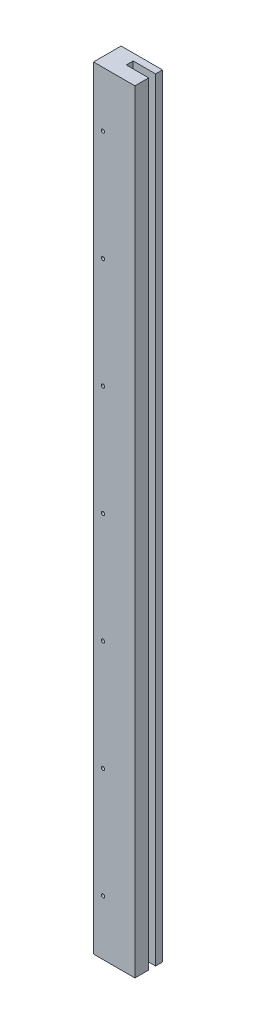
ISO-10303-21;
HEADER;
FILE_DESCRIPTION(('STEP AP214'),'2;1');
FILE_NAME('part.step','',(''),(''),'','','');
FILE_SCHEMA(('AUTOMOTIVE_DESIGN { 1 0 10303 214 1 1 1 1 }'));
ENDSEC;
DATA;
#1=APPLICATION_CONTEXT('core data for automotive mechanical design processes');
#2=APPLICATION_PROTOCOL_DEFINITION('international standard','automotive_design',2000,#1);
#3=PRODUCT_CONTEXT('',#1,'mechanical');
#4=PRODUCT('Part','Part','',(#3));
#5=PRODUCT_RELATED_PRODUCT_CATEGORY('part','',(#4));
#6=PRODUCT_DEFINITION_FORMATION('','',#4);
#7=PRODUCT_DEFINITION_CONTEXT('part definition',#1,'design');
#8=PRODUCT_DEFINITION('design','',#6,#7);
#9=PRODUCT_DEFINITION_SHAPE('','',#8);
#10=(LENGTH_UNIT() NAMED_UNIT(*) SI_UNIT(.MILLI.,.METRE.));
#11=(NAMED_UNIT(*) PLANE_ANGLE_UNIT() SI_UNIT($,.RADIAN.));
#12=(NAMED_UNIT(*) SI_UNIT($,.STERADIAN.) SOLID_ANGLE_UNIT());
#13=UNCERTAINTY_MEASURE_WITH_UNIT(LENGTH_MEASURE(1.E-05),#10,'distance_accuracy_value','');
#14=(GEOMETRIC_REPRESENTATION_CONTEXT(3) GLOBAL_UNCERTAINTY_ASSIGNED_CONTEXT((#13)) GLOBAL_UNIT_ASSIGNED_CONTEXT((#10,
#11,#12)) REPRESENTATION_CONTEXT('',''));
#15=CARTESIAN_POINT('',(0.,0.,0.));
#16=DIRECTION('',(0.,0.,1.));
#17=DIRECTION('',(1.,0.,0.));
#18=AXIS2_PLACEMENT_3D('',#15,#16,#17);
#19=CARTESIAN_POINT('',(-458.7875,756.990501198393,292.1));
#20=DIRECTION('',(-1.,0.,0.));
#21=DIRECTION('',(0.,0.,1.));
#22=AXIS2_PLACEMENT_3D('',#19,#20,#21);
#23=PLANE('',#22);
#24=DIRECTION('',(0.,-1.,0.));
#25=VECTOR('',#24,1.);
#26=CARTESIAN_POINT('',(-458.7875,756.990501198393,292.1));
#27=LINE('',#26,#25);
#28=CARTESIAN_POINT('',(-458.7875,609.6,292.1));
#29=VERTEX_POINT('',#28);
#30=CARTESIAN_POINT('',(-458.7875,508.,292.1));
#31=VERTEX_POINT('',#30);
#32=EDGE_CURVE('E254',#29,#31,#27,.T.);
#33=ORIENTED_EDGE('',*,*,#32,.T.);
#34=CARTESIAN_POINT('',(-458.7875,508.,288.925));
#35=DIRECTION('',(1.,0.,0.));
#36=DIRECTION('',(0.,0.,-1.));
#37=AXIS2_PLACEMENT_3D('',#34,#35,#36);
#38=CIRCLE('',#37,3.17499999999997);
#39=CARTESIAN_POINT('',(-458.7875,508.,285.75));
#40=VERTEX_POINT('',#39);
#41=EDGE_CURVE('E280',#40,#31,#38,.T.);
#42=ORIENTED_EDGE('',*,*,#41,.F.);
#43=DIRECTION('',(0.,-1.,0.));
#44=VECTOR('',#43,1.);
#45=CARTESIAN_POINT('',(-458.7875,756.990501198393,285.75));
#46=LINE('',#45,#44);
#47=CARTESIAN_POINT('',(-458.7875,609.6,285.75));
#48=VERTEX_POINT('',#47);
#49=EDGE_CURVE('E173',#48,#40,#46,.T.);
#50=ORIENTED_EDGE('',*,*,#49,.F.);
#51=CARTESIAN_POINT('',(-458.7875,609.6,288.925));
#52=DIRECTION('',(1.,0.,0.));
#53=DIRECTION('',(0.,0.,-1.));
#54=AXIS2_PLACEMENT_3D('',#51,#52,#53);
#55=CIRCLE('',#54,3.17499999999997);
#56=EDGE_CURVE('E281',#29,#48,#55,.T.);
#57=ORIENTED_EDGE('',*,*,#56,.F.);
#58=EDGE_LOOP('',(#33,#42,#50,#57));
#59=FACE_BOUND('',#58,.T.);
#60=ADVANCED_FACE('F37',(#59),#23,.F.);
#61=CARTESIAN_POINT('',(-458.7875,406.4,285.75));
#62=VERTEX_POINT('',#61);
#63=EDGE_CURVE('E416',#40,#62,#46,.T.);
#64=ORIENTED_EDGE('',*,*,#63,.F.);
#65=EDGE_CURVE('E275',#31,#40,#38,.T.);
#66=ORIENTED_EDGE('',*,*,#65,.F.);
#67=CARTESIAN_POINT('',(-458.7875,406.4,292.1));
#68=VERTEX_POINT('',#67);
#69=EDGE_CURVE('E255',#31,#68,#27,.T.);
#70=ORIENTED_EDGE('',*,*,#69,.T.);
#71=CARTESIAN_POINT('',(-458.7875,406.4,288.925));
#72=DIRECTION('',(1.,0.,0.));
#73=DIRECTION('',(0.,0.,-1.));
#74=AXIS2_PLACEMENT_3D('',#71,#72,#73);
#75=CIRCLE('',#74,3.17499999999997);
#76=EDGE_CURVE('E273',#62,#68,#75,.T.);
#77=ORIENTED_EDGE('',*,*,#76,.F.);
#78=EDGE_LOOP('',(#64,#66,#70,#77));
#79=FACE_BOUND('',#78,.T.);
#80=ADVANCED_FACE('F272',(#79),#23,.F.);
#81=CARTESIAN_POINT('',(-458.7875,304.8,285.75));
#82=VERTEX_POINT('',#81);
#83=EDGE_CURVE('E168',#62,#82,#46,.T.);
#84=ORIENTED_EDGE('',*,*,#83,.F.);
#85=EDGE_CURVE('E305',#68,#62,#75,.T.);
#86=ORIENTED_EDGE('',*,*,#85,.F.);
#87=CARTESIAN_POINT('',(-458.7875,304.8,292.1));
#88=VERTEX_POINT('',#87);
#89=EDGE_CURVE('E258',#68,#88,#27,.T.);
#90=ORIENTED_EDGE('',*,*,#89,.T.);
#91=CARTESIAN_POINT('',(-458.7875,304.8,288.925));
#92=DIRECTION('',(1.,0.,0.));
#93=DIRECTION('',(0.,0.,-1.));
#94=AXIS2_PLACEMENT_3D('',#91,#92,#93);
#95=CIRCLE('',#94,3.17499999999997);
#96=EDGE_CURVE('E300',#82,#88,#95,.T.);
#97=ORIENTED_EDGE('',*,*,#96,.F.);
#98=EDGE_LOOP('',(#84,#86,#90,#97));
#99=FACE_BOUND('',#98,.T.);
#100=ADVANCED_FACE('F396',(#99),#23,.F.);
#101=CARTESIAN_POINT('',(-458.7875,203.2,285.75));
#102=VERTEX_POINT('',#101);
#103=EDGE_CURVE('E167',#82,#102,#46,.T.);
#104=ORIENTED_EDGE('',*,*,#103,.F.);
#105=EDGE_CURVE('E299',#88,#82,#95,.T.);
#106=ORIENTED_EDGE('',*,*,#105,.F.);
#107=CARTESIAN_POINT('',(-458.7875,203.2,292.1));
#108=VERTEX_POINT('',#107);
#109=EDGE_CURVE('E256',#88,#108,#27,.T.);
#110=ORIENTED_EDGE('',*,*,#109,.T.);
#111=CARTESIAN_POINT('',(-458.7875,203.2,288.925));
#112=DIRECTION('',(1.,0.,0.));
#113=DIRECTION('',(0.,0.,-1.));
#114=AXIS2_PLACEMENT_3D('',#111,#112,#113);
#115=CIRCLE('',#114,3.17499999999997);
#116=EDGE_CURVE('E60',#102,#108,#115,.T.);
#117=ORIENTED_EDGE('',*,*,#116,.F.);
#118=EDGE_LOOP('',(#104,#106,#110,#117));
#119=FACE_BOUND('',#118,.T.);
#120=ADVANCED_FACE('F408',(#119),#23,.F.);
#121=CARTESIAN_POINT('',(-458.7875,101.6,285.75));
#122=VERTEX_POINT('',#121);
#123=EDGE_CURVE('E149',#102,#122,#46,.T.);
#124=ORIENTED_EDGE('',*,*,#123,.F.);
#125=EDGE_CURVE('E294',#108,#102,#115,.T.);
#126=ORIENTED_EDGE('',*,*,#125,.F.);
#127=CARTESIAN_POINT('',(-458.7875,101.6,292.1));
#128=VERTEX_POINT('',#127);
#129=EDGE_CURVE('E152',#108,#128,#27,.T.);
#130=ORIENTED_EDGE('',*,*,#129,.T.);
#131=CARTESIAN_POINT('',(-458.7875,101.6,288.925));
#132=DIRECTION('',(1.,0.,0.));
#133=DIRECTION('',(0.,0.,-1.));
#134=AXIS2_PLACEMENT_3D('',#131,#132,#133);
#135=CIRCLE('',#134,3.17499999999997);
#136=EDGE_CURVE('E53',#122,#128,#135,.T.);
#137=ORIENTED_EDGE('',*,*,#136,.F.);
#138=EDGE_LOOP('',(#124,#126,#130,#137));
#139=FACE_BOUND('',#138,.T.);
#140=ADVANCED_FACE('F147',(#139),#23,.F.);
#141=CARTESIAN_POINT('',(-458.7875,711.2,292.1));
#142=VERTEX_POINT('',#141);
#143=EDGE_CURVE('E174',#142,#29,#27,.T.);
#144=ORIENTED_EDGE('',*,*,#143,.T.);
#145=EDGE_CURVE('E284',#48,#29,#55,.T.);
#146=ORIENTED_EDGE('',*,*,#145,.F.);
#147=CARTESIAN_POINT('',(-458.7875,711.2,285.75));
#148=VERTEX_POINT('',#147);
#149=EDGE_CURVE('E163',#148,#48,#46,.T.);
#150=ORIENTED_EDGE('',*,*,#149,.F.);
#151=DIRECTION('',(0.,0.,-1.));
#152=VECTOR('',#151,1.);
#153=CARTESIAN_POINT('',(-458.7875,711.2,292.1));
#154=LINE('',#153,#152);
#155=EDGE_CURVE('E216',#142,#148,#154,.T.);
#156=ORIENTED_EDGE('',*,*,#155,.F.);
#157=EDGE_LOOP('',(#144,#146,#150,#156));
#158=FACE_BOUND('',#157,.T.);
#159=ADVANCED_FACE('F249',(#158),#23,.F.);
#160=CARTESIAN_POINT('',(-476.25,756.990501198393,304.8));
#161=DIRECTION('',(0.,0.,-1.));
#162=DIRECTION('',(-1.,0.,0.));
#163=AXIS2_PLACEMENT_3D('',#160,#161,#162);
#164=PLANE('',#163);
#165=CARTESIAN_POINT('',(-467.51875,660.4,304.8));
#166=DIRECTION('',(0.,0.,1.));
#167=DIRECTION('',(1.,0.,0.));
#168=AXIS2_PLACEMENT_3D('',#165,#166,#167);
#169=CIRCLE('',#168,1.58750000000004);
#170=CARTESIAN_POINT('',(-465.93125,660.4,304.8));
#171=VERTEX_POINT('',#170);
#172=EDGE_CURVE('E346',#171,#171,#169,.T.);
#173=ORIENTED_EDGE('',*,*,#172,.F.);
#174=EDGE_LOOP('',(#173));
#175=FACE_BOUND('',#174,.T.);
#176=CARTESIAN_POINT('',(-467.51875,558.8,304.8));
#177=DIRECTION('',(0.,0.,1.));
#178=DIRECTION('',(1.,0.,0.));
#179=AXIS2_PLACEMENT_3D('',#176,#177,#178);
#180=CIRCLE('',#179,1.58750000000004);
#181=CARTESIAN_POINT('',(-465.93125,558.8,304.8));
#182=VERTEX_POINT('',#181);
#183=EDGE_CURVE('E340',#182,#182,#180,.T.);
#184=ORIENTED_EDGE('',*,*,#183,.F.);
#185=EDGE_LOOP('',(#184));
#186=FACE_BOUND('',#185,.T.);
#187=CARTESIAN_POINT('',(-467.51875,457.2,304.8));
#188=DIRECTION('',(0.,0.,1.));
#189=DIRECTION('',(1.,0.,0.));
#190=AXIS2_PLACEMENT_3D('',#187,#188,#189);
#191=CIRCLE('',#190,1.58750000000004);
#192=CARTESIAN_POINT('',(-465.93125,457.2,304.8));
#193=VERTEX_POINT('',#192);
#194=EDGE_CURVE('E334',#193,#193,#191,.T.);
#195=ORIENTED_EDGE('',*,*,#194,.F.);
#196=EDGE_LOOP('',(#195));
#197=FACE_BOUND('',#196,.T.);
#198=CARTESIAN_POINT('',(-467.51875,355.6,304.8));
#199=DIRECTION('',(0.,0.,1.));
#200=DIRECTION('',(1.,0.,0.));
#201=AXIS2_PLACEMENT_3D('',#198,#199,#200);
#202=CIRCLE('',#201,1.58750000000004);
#203=CARTESIAN_POINT('',(-465.93125,355.6,304.8));
#204=VERTEX_POINT('',#203);
#205=EDGE_CURVE('E328',#204,#204,#202,.T.);
#206=ORIENTED_EDGE('',*,*,#205,.F.);
#207=EDGE_LOOP('',(#206));
#208=FACE_BOUND('',#207,.T.);
#209=CARTESIAN_POINT('',(-467.51875,254.,304.8));
#210=DIRECTION('',(0.,0.,1.));
#211=DIRECTION('',(1.,0.,0.));
#212=AXIS2_PLACEMENT_3D('',#209,#210,#211);
#213=CIRCLE('',#212,1.58750000000004);
#214=CARTESIAN_POINT('',(-465.93125,254.,304.8));
#215=VERTEX_POINT('',#214);
#216=EDGE_CURVE('E322',#215,#215,#213,.T.);
#217=ORIENTED_EDGE('',*,*,#216,.F.);
#218=EDGE_LOOP('',(#217));
#219=FACE_BOUND('',#218,.T.);
#220=CARTESIAN_POINT('',(-467.51875,152.4,304.8));
#221=DIRECTION('',(0.,0.,1.));
#222=DIRECTION('',(1.,0.,0.));
#223=AXIS2_PLACEMENT_3D('',#220,#221,#222);
#224=CIRCLE('',#223,1.58750000000004);
#225=CARTESIAN_POINT('',(-465.93125,152.4,304.8));
#226=VERTEX_POINT('',#225);
#227=EDGE_CURVE('E314',#226,#226,#224,.T.);
#228=ORIENTED_EDGE('',*,*,#227,.F.);
#229=EDGE_LOOP('',(#228));
#230=FACE_BOUND('',#229,.T.);
#231=CARTESIAN_POINT('',(-467.51875,50.8,304.8));
#232=DIRECTION('',(0.,0.,1.));
#233=DIRECTION('',(1.,0.,0.));
#234=AXIS2_PLACEMENT_3D('',#231,#232,#233);
#235=CIRCLE('',#234,1.58750000000004);
#236=CARTESIAN_POINT('',(-465.93125,50.8,304.8));
#237=VERTEX_POINT('',#236);
#238=EDGE_CURVE('E311',#237,#237,#235,.T.);
#239=ORIENTED_EDGE('',*,*,#238,.F.);
#240=EDGE_LOOP('',(#239));
#241=FACE_BOUND('',#240,.T.);
#242=DIRECTION('',(1.,0.,0.));
#243=VECTOR('',#242,1.);
#244=CARTESIAN_POINT('',(-476.25,711.2,304.8));
#245=LINE('',#244,#243);
#246=CARTESIAN_POINT('',(-476.25,711.2,304.8));
#247=VERTEX_POINT('',#246);
#248=CARTESIAN_POINT('',(-438.15,711.2,304.8));
#249=VERTEX_POINT('',#248);
#250=EDGE_CURVE('E225',#247,#249,#245,.T.);
#251=ORIENTED_EDGE('',*,*,#250,.F.);
#252=DIRECTION('',(0.,-1.,0.));
#253=VECTOR('',#252,1.);
#254=CARTESIAN_POINT('',(-476.25,756.990501198393,304.8));
#255=LINE('',#254,#253);
#256=CARTESIAN_POINT('',(-476.25,0.,304.8));
#257=VERTEX_POINT('',#256);
#258=EDGE_CURVE('E41',#247,#257,#255,.T.);
#259=ORIENTED_EDGE('',*,*,#258,.T.);
#260=DIRECTION('',(1.,0.,0.));
#261=VECTOR('',#260,1.);
#262=CARTESIAN_POINT('',(-476.25,0.,304.8));
#263=LINE('',#262,#261);
#264=CARTESIAN_POINT('',(-438.15,0.,304.8));
#265=VERTEX_POINT('',#264);
#266=EDGE_CURVE('E208',#257,#265,#263,.T.);
#267=ORIENTED_EDGE('',*,*,#266,.T.);
#268=DIRECTION('',(0.,-1.,0.));
#269=VECTOR('',#268,1.);
#270=CARTESIAN_POINT('',(-438.15,756.990501198393,304.8));
#271=LINE('',#270,#269);
#272=EDGE_CURVE('E207',#249,#265,#271,.T.);
#273=ORIENTED_EDGE('',*,*,#272,.F.);
#274=EDGE_LOOP('',(#251,#259,#267,#273));
#275=FACE_BOUND('',#274,.T.);
#276=ADVANCED_FACE('F363',(#175,#186,#197,#208,#219,#230,#241,#275),#164,.F.);
#277=CARTESIAN_POINT('',(-438.15,756.990501198393,304.8));
#278=DIRECTION('',(-1.,0.,0.));
#279=DIRECTION('',(0.,0.,1.));
#280=AXIS2_PLACEMENT_3D('',#277,#278,#279);
#281=PLANE('',#280);
#282=DIRECTION('',(0.,0.,-1.));
#283=VECTOR('',#282,1.);
#284=CARTESIAN_POINT('',(-438.15,711.2,304.8));
#285=LINE('',#284,#283);
#286=CARTESIAN_POINT('',(-438.15,711.2,292.1));
#287=VERTEX_POINT('',#286);
#288=EDGE_CURVE('E222',#249,#287,#285,.T.);
#289=ORIENTED_EDGE('',*,*,#288,.F.);
#290=ORIENTED_EDGE('',*,*,#272,.T.);
#291=DIRECTION('',(0.,0.,-1.));
#292=VECTOR('',#291,1.);
#293=CARTESIAN_POINT('',(-438.15,0.,304.8));
#294=LINE('',#293,#292);
#295=CARTESIAN_POINT('',(-438.15,0.,292.1));
#296=VERTEX_POINT('',#295);
#297=EDGE_CURVE('E204',#265,#296,#294,.T.);
#298=ORIENTED_EDGE('',*,*,#297,.T.);
#299=DIRECTION('',(0.,-1.,0.));
#300=VECTOR('',#299,1.);
#301=CARTESIAN_POINT('',(-438.15,756.990501198393,292.1));
#302=LINE('',#301,#300);
#303=EDGE_CURVE('E203',#287,#296,#302,.T.);
#304=ORIENTED_EDGE('',*,*,#303,.F.);
#305=EDGE_LOOP('',(#289,#290,#298,#304));
#306=FACE_BOUND('',#305,.T.);
#307=ADVANCED_FACE('F237',(#306),#281,.F.);
#308=CARTESIAN_POINT('',(-438.15,756.990501198393,292.1));
#309=DIRECTION('',(0.,0.,1.));
#310=DIRECTION('',(1.,0.,0.));
#311=AXIS2_PLACEMENT_3D('',#308,#309,#310);
#312=PLANE('',#311);
#313=DIRECTION('',(-1.,0.,0.));
#314=VECTOR('',#313,1.);
#315=CARTESIAN_POINT('',(-438.15,711.2,292.1));
#316=LINE('',#315,#314);
#317=EDGE_CURVE('E219',#287,#142,#316,.T.);
#318=ORIENTED_EDGE('',*,*,#317,.F.);
#319=ORIENTED_EDGE('',*,*,#303,.T.);
#320=DIRECTION('',(-1.,0.,0.));
#321=VECTOR('',#320,1.);
#322=CARTESIAN_POINT('',(-438.15,0.,292.1));
#323=LINE('',#322,#321);
#324=CARTESIAN_POINT('',(-458.7875,0.,292.1));
#325=VERTEX_POINT('',#324);
#326=EDGE_CURVE('E199',#296,#325,#323,.T.);
#327=ORIENTED_EDGE('',*,*,#326,.T.);
#328=EDGE_CURVE('E202',#128,#325,#27,.T.);
#329=ORIENTED_EDGE('',*,*,#328,.F.);
#330=ORIENTED_EDGE('',*,*,#129,.F.);
#331=ORIENTED_EDGE('',*,*,#109,.F.);
#332=ORIENTED_EDGE('',*,*,#89,.F.);
#333=ORIENTED_EDGE('',*,*,#69,.F.);
#334=ORIENTED_EDGE('',*,*,#32,.F.);
#335=ORIENTED_EDGE('',*,*,#143,.F.);
#336=EDGE_LOOP('',(#318,#319,#327,#329,#330,#331,#332,#333,#334,#335));
#337=FACE_BOUND('',#336,.T.);
#338=ADVANCED_FACE('F232',(#337),#312,.F.);
#339=CARTESIAN_POINT('',(-458.7875,0.,285.75));
#340=VERTEX_POINT('',#339);
#341=EDGE_CURVE('E155',#122,#340,#46,.T.);
#342=ORIENTED_EDGE('',*,*,#341,.F.);
#343=EDGE_CURVE('E137',#128,#122,#135,.T.);
#344=ORIENTED_EDGE('',*,*,#343,.F.);
#345=ORIENTED_EDGE('',*,*,#328,.T.);
#346=DIRECTION('',(0.,0.,-1.));
#347=VECTOR('',#346,1.);
#348=CARTESIAN_POINT('',(-458.7875,0.,292.1));
#349=LINE('',#348,#347);
#350=EDGE_CURVE('E158',#325,#340,#349,.T.);
#351=ORIENTED_EDGE('',*,*,#350,.T.);
#352=EDGE_LOOP('',(#342,#344,#345,#351));
#353=FACE_BOUND('',#352,.T.);
#354=ADVANCED_FACE('F156',(#353),#23,.F.);
#355=CARTESIAN_POINT('',(-458.7875,756.990501198393,285.75));
#356=DIRECTION('',(0.,0.,-1.));
#357=DIRECTION('',(-1.,0.,0.));
#358=AXIS2_PLACEMENT_3D('',#355,#356,#357);
#359=PLANE('',#358);
#360=DIRECTION('',(1.,0.,0.));
#361=VECTOR('',#360,1.);
#362=CARTESIAN_POINT('',(-458.7875,711.2,285.75));
#363=LINE('',#362,#361);
#364=CARTESIAN_POINT('',(-438.15,711.2,285.75));
#365=VERTEX_POINT('',#364);
#366=EDGE_CURVE('E213',#148,#365,#363,.T.);
#367=ORIENTED_EDGE('',*,*,#366,.F.);
#368=ORIENTED_EDGE('',*,*,#149,.T.);
#369=ORIENTED_EDGE('',*,*,#49,.T.);
#370=ORIENTED_EDGE('',*,*,#63,.T.);
#371=ORIENTED_EDGE('',*,*,#83,.T.);
#372=ORIENTED_EDGE('',*,*,#103,.T.);
#373=ORIENTED_EDGE('',*,*,#123,.T.);
#374=ORIENTED_EDGE('',*,*,#341,.T.);
#375=DIRECTION('',(1.,0.,0.));
#376=VECTOR('',#375,1.);
#377=CARTESIAN_POINT('',(-458.7875,0.,285.75));
#378=LINE('',#377,#376);
#379=CARTESIAN_POINT('',(-438.15,0.,285.75));
#380=VERTEX_POINT('',#379);
#381=EDGE_CURVE('E172',#340,#380,#378,.T.);
#382=ORIENTED_EDGE('',*,*,#381,.T.);
#383=DIRECTION('',(0.,-1.,0.));
#384=VECTOR('',#383,1.);
#385=CARTESIAN_POINT('',(-438.15,756.990501198393,285.75));
#386=LINE('',#385,#384);
#387=EDGE_CURVE('E176',#365,#380,#386,.T.);
#388=ORIENTED_EDGE('',*,*,#387,.F.);
#389=EDGE_LOOP('',(#367,#368,#369,#370,#371,#372,#373,#374,#382,#388));
#390=FACE_BOUND('',#389,.T.);
#391=ADVANCED_FACE('F164',(#390),#359,.F.);
#392=CARTESIAN_POINT('',(-438.15,756.990501198393,285.75));
#393=DIRECTION('',(-1.,0.,0.));
#394=DIRECTION('',(0.,0.,1.));
#395=AXIS2_PLACEMENT_3D('',#392,#393,#394);
#396=PLANE('',#395);
#397=DIRECTION('',(0.,0.,-1.));
#398=VECTOR('',#397,1.);
#399=CARTESIAN_POINT('',(-438.15,711.2,285.75));
#400=LINE('',#399,#398);
#401=CARTESIAN_POINT('',(-438.15,711.2,279.4));
#402=VERTEX_POINT('',#401);
#403=EDGE_CURVE('E46',#365,#402,#400,.T.);
#404=ORIENTED_EDGE('',*,*,#403,.F.);
#405=ORIENTED_EDGE('',*,*,#387,.T.);
#406=DIRECTION('',(0.,0.,-1.));
#407=VECTOR('',#406,1.);
#408=CARTESIAN_POINT('',(-438.15,0.,285.75));
#409=LINE('',#408,#407);
#410=CARTESIAN_POINT('',(-438.15,0.,279.4));
#411=VERTEX_POINT('',#410);
#412=EDGE_CURVE('E178',#380,#411,#409,.T.);
#413=ORIENTED_EDGE('',*,*,#412,.T.);
#414=DIRECTION('',(0.,-1.,0.));
#415=VECTOR('',#414,1.);
#416=CARTESIAN_POINT('',(-438.15,756.990501198393,279.4));
#417=LINE('',#416,#415);
#418=EDGE_CURVE('E179',#402,#411,#417,.T.);
#419=ORIENTED_EDGE('',*,*,#418,.F.);
#420=EDGE_LOOP('',(#404,#405,#413,#419));
#421=FACE_BOUND('',#420,.T.);
#422=ADVANCED_FACE('F388',(#421),#396,.F.);
#423=CARTESIAN_POINT('',(-438.15,756.990501198393,279.4));
#424=DIRECTION('',(0.,0.,1.));
#425=DIRECTION('',(1.,0.,0.));
#426=AXIS2_PLACEMENT_3D('',#423,#424,#425);
#427=PLANE('',#426);
#428=CARTESIAN_POINT('',(-467.51875,660.4,279.4));
#429=DIRECTION('',(0.,0.,1.));
#430=DIRECTION('',(1.,0.,0.));
#431=AXIS2_PLACEMENT_3D('',#428,#429,#430);
#432=CIRCLE('',#431,1.58750000000004);
#433=CARTESIAN_POINT('',(-465.93125,660.4,279.4));
#434=VERTEX_POINT('',#433);
#435=EDGE_CURVE('E349',#434,#434,#432,.T.);
#436=ORIENTED_EDGE('',*,*,#435,.T.);
#437=EDGE_LOOP('',(#436));
#438=FACE_BOUND('',#437,.T.);
#439=CARTESIAN_POINT('',(-467.51875,558.8,279.4));
#440=DIRECTION('',(0.,0.,1.));
#441=DIRECTION('',(1.,0.,0.));
#442=AXIS2_PLACEMENT_3D('',#439,#440,#441);
#443=CIRCLE('',#442,1.58750000000004);
#444=CARTESIAN_POINT('',(-465.93125,558.8,279.4));
#445=VERTEX_POINT('',#444);
#446=EDGE_CURVE('E343',#445,#445,#443,.T.);
#447=ORIENTED_EDGE('',*,*,#446,.T.);
#448=EDGE_LOOP('',(#447));
#449=FACE_BOUND('',#448,.T.);
#450=CARTESIAN_POINT('',(-467.51875,457.2,279.4));
#451=DIRECTION('',(0.,0.,1.));
#452=DIRECTION('',(1.,0.,0.));
#453=AXIS2_PLACEMENT_3D('',#450,#451,#452);
#454=CIRCLE('',#453,1.58750000000004);
#455=CARTESIAN_POINT('',(-465.93125,457.2,279.4));
#456=VERTEX_POINT('',#455);
#457=EDGE_CURVE('E337',#456,#456,#454,.T.);
#458=ORIENTED_EDGE('',*,*,#457,.T.);
#459=EDGE_LOOP('',(#458));
#460=FACE_BOUND('',#459,.T.);
#461=CARTESIAN_POINT('',(-467.51875,355.6,279.4));
#462=DIRECTION('',(0.,0.,1.));
#463=DIRECTION('',(1.,0.,0.));
#464=AXIS2_PLACEMENT_3D('',#461,#462,#463);
#465=CIRCLE('',#464,1.58750000000004);
#466=CARTESIAN_POINT('',(-465.93125,355.6,279.4));
#467=VERTEX_POINT('',#466);
#468=EDGE_CURVE('E331',#467,#467,#465,.T.);
#469=ORIENTED_EDGE('',*,*,#468,.T.);
#470=EDGE_LOOP('',(#469));
#471=FACE_BOUND('',#470,.T.);
#472=CARTESIAN_POINT('',(-467.51875,254.,279.4));
#473=DIRECTION('',(0.,0.,1.));
#474=DIRECTION('',(1.,0.,0.));
#475=AXIS2_PLACEMENT_3D('',#472,#473,#474);
#476=CIRCLE('',#475,1.58750000000004);
#477=CARTESIAN_POINT('',(-465.93125,254.,279.4));
#478=VERTEX_POINT('',#477);
#479=EDGE_CURVE('E325',#478,#478,#476,.T.);
#480=ORIENTED_EDGE('',*,*,#479,.T.);
#481=EDGE_LOOP('',(#480));
#482=FACE_BOUND('',#481,.T.);
#483=CARTESIAN_POINT('',(-467.51875,152.4,279.4));
#484=DIRECTION('',(0.,0.,1.));
#485=DIRECTION('',(1.,0.,0.));
#486=AXIS2_PLACEMENT_3D('',#483,#484,#485);
#487=CIRCLE('',#486,1.58750000000004);
#488=CARTESIAN_POINT('',(-465.93125,152.4,279.4));
#489=VERTEX_POINT('',#488);
#490=EDGE_CURVE('E319',#489,#489,#487,.T.);
#491=ORIENTED_EDGE('',*,*,#490,.T.);
#492=EDGE_LOOP('',(#491));
#493=FACE_BOUND('',#492,.T.);
#494=CARTESIAN_POINT('',(-467.51875,50.8,279.4));
#495=DIRECTION('',(0.,0.,1.));
#496=DIRECTION('',(1.,0.,0.));
#497=AXIS2_PLACEMENT_3D('',#494,#495,#496);
#498=CIRCLE('',#497,1.58750000000004);
#499=CARTESIAN_POINT('',(-465.93125,50.8,279.4));
#500=VERTEX_POINT('',#499);
#501=EDGE_CURVE('E142',#500,#500,#498,.T.);
#502=ORIENTED_EDGE('',*,*,#501,.T.);
#503=EDGE_LOOP('',(#502));
#504=FACE_BOUND('',#503,.T.);
#505=DIRECTION('',(-1.,0.,0.));
#506=VECTOR('',#505,1.);
#507=CARTESIAN_POINT('',(-438.15,711.2,279.4));
#508=LINE('',#507,#506);
#509=CARTESIAN_POINT('',(-476.25,711.2,279.4));
#510=VERTEX_POINT('',#509);
#511=EDGE_CURVE('E11',#402,#510,#508,.T.);
#512=ORIENTED_EDGE('',*,*,#511,.F.);
#513=ORIENTED_EDGE('',*,*,#418,.T.);
#514=DIRECTION('',(-1.,0.,0.));
#515=VECTOR('',#514,1.);
#516=CARTESIAN_POINT('',(-438.15,0.,279.4));
#517=LINE('',#516,#515);
#518=CARTESIAN_POINT('',(-476.25,0.,279.4));
#519=VERTEX_POINT('',#518);
#520=EDGE_CURVE('E180',#411,#519,#517,.T.);
#521=ORIENTED_EDGE('',*,*,#520,.T.);
#522=DIRECTION('',(0.,-1.,0.));
#523=VECTOR('',#522,1.);
#524=CARTESIAN_POINT('',(-476.25,756.990501198393,279.4));
#525=LINE('',#524,#523);
#526=EDGE_CURVE('E181',#510,#519,#525,.T.);
#527=ORIENTED_EDGE('',*,*,#526,.F.);
#528=EDGE_LOOP('',(#512,#513,#521,#527));
#529=FACE_BOUND('',#528,.T.);
#530=ADVANCED_FACE('F353',(#438,#449,#460,#471,#482,#493,#504,#529),#427,.F.);
#531=CARTESIAN_POINT('',(-476.25,756.990501198393,279.4));
#532=DIRECTION('',(1.,0.,0.));
#533=DIRECTION('',(0.,0.,-1.));
#534=AXIS2_PLACEMENT_3D('',#531,#532,#533);
#535=PLANE('',#534);
#536=CARTESIAN_POINT('',(-476.25,508.,288.925));
#537=DIRECTION('',(1.,0.,0.));
#538=DIRECTION('',(0.,0.,-1.));
#539=AXIS2_PLACEMENT_3D('',#536,#537,#538);
#540=CIRCLE('',#539,3.17499999999997);
#541=CARTESIAN_POINT('',(-476.25,508.,285.75));
#542=VERTEX_POINT('',#541);
#543=EDGE_CURVE('E285',#542,#542,#540,.T.);
#544=ORIENTED_EDGE('',*,*,#543,.T.);
#545=EDGE_LOOP('',(#544));
#546=FACE_BOUND('',#545,.T.);
#547=CARTESIAN_POINT('',(-476.25,406.4,288.925));
#548=DIRECTION('',(1.,0.,0.));
#549=DIRECTION('',(0.,0.,-1.));
#550=AXIS2_PLACEMENT_3D('',#547,#548,#549);
#551=CIRCLE('',#550,3.17499999999997);
#552=CARTESIAN_POINT('',(-476.25,406.4,285.75));
#553=VERTEX_POINT('',#552);
#554=EDGE_CURVE('E307',#553,#553,#551,.T.);
#555=ORIENTED_EDGE('',*,*,#554,.T.);
#556=EDGE_LOOP('',(#555));
#557=FACE_BOUND('',#556,.T.);
#558=CARTESIAN_POINT('',(-476.25,304.8,288.925));
#559=DIRECTION('',(1.,0.,0.));
#560=DIRECTION('',(0.,0.,-1.));
#561=AXIS2_PLACEMENT_3D('',#558,#559,#560);
#562=CIRCLE('',#561,3.17499999999997);
#563=CARTESIAN_POINT('',(-476.25,304.8,285.75));
#564=VERTEX_POINT('',#563);
#565=EDGE_CURVE('E302',#564,#564,#562,.T.);
#566=ORIENTED_EDGE('',*,*,#565,.T.);
#567=EDGE_LOOP('',(#566));
#568=FACE_BOUND('',#567,.T.);
#569=CARTESIAN_POINT('',(-476.25,203.2,288.925));
#570=DIRECTION('',(1.,0.,0.));
#571=DIRECTION('',(0.,0.,-1.));
#572=AXIS2_PLACEMENT_3D('',#569,#570,#571);
#573=CIRCLE('',#572,3.17499999999997);
#574=CARTESIAN_POINT('',(-476.25,203.2,285.75));
#575=VERTEX_POINT('',#574);
#576=EDGE_CURVE('E296',#575,#575,#573,.T.);
#577=ORIENTED_EDGE('',*,*,#576,.T.);
#578=EDGE_LOOP('',(#577));
#579=FACE_BOUND('',#578,.T.);
#580=CARTESIAN_POINT('',(-476.25,101.6,288.925));
#581=DIRECTION('',(1.,0.,0.));
#582=DIRECTION('',(0.,0.,-1.));
#583=AXIS2_PLACEMENT_3D('',#580,#581,#582);
#584=CIRCLE('',#583,3.17499999999997);
#585=CARTESIAN_POINT('',(-476.25,101.6,285.75));
#586=VERTEX_POINT('',#585);
#587=EDGE_CURVE('E153',#586,#586,#584,.T.);
#588=ORIENTED_EDGE('',*,*,#587,.T.);
#589=EDGE_LOOP('',(#588));
#590=FACE_BOUND('',#589,.T.);
#591=CARTESIAN_POINT('',(-476.25,609.6,288.925));
#592=DIRECTION('',(1.,0.,0.));
#593=DIRECTION('',(0.,0.,-1.));
#594=AXIS2_PLACEMENT_3D('',#591,#592,#593);
#595=CIRCLE('',#594,3.17499999999997);
#596=CARTESIAN_POINT('',(-476.25,609.6,285.75));
#597=VERTEX_POINT('',#596);
#598=EDGE_CURVE('E286',#597,#597,#595,.T.);
#599=ORIENTED_EDGE('',*,*,#598,.T.);
#600=EDGE_LOOP('',(#599));
#601=FACE_BOUND('',#600,.T.);
#602=DIRECTION('',(0.,0.,1.));
#603=VECTOR('',#602,1.);
#604=CARTESIAN_POINT('',(-476.25,711.2,279.4));
#605=LINE('',#604,#603);
#606=EDGE_CURVE('E187',#510,#247,#605,.T.);
#607=ORIENTED_EDGE('',*,*,#606,.F.);
#608=ORIENTED_EDGE('',*,*,#526,.T.);
#609=DIRECTION('',(0.,0.,1.));
#610=VECTOR('',#609,1.);
#611=CARTESIAN_POINT('',(-476.25,0.,279.4));
#612=LINE('',#611,#610);
#613=EDGE_CURVE('E182',#519,#257,#612,.T.);
#614=ORIENTED_EDGE('',*,*,#613,.T.);
#615=ORIENTED_EDGE('',*,*,#258,.F.);
#616=EDGE_LOOP('',(#607,#608,#614,#615));
#617=FACE_BOUND('',#616,.T.);
#618=ADVANCED_FACE('F379',(#546,#557,#568,#579,#590,#601,#617),#535,.F.);
#619=CARTESIAN_POINT('',(0.,0.,0.));
#620=DIRECTION('',(0.,1.,0.));
#621=DIRECTION('',(0.,0.,1.));
#622=AXIS2_PLACEMENT_3D('',#619,#620,#621);
#623=PLANE('',#622);
#624=ORIENTED_EDGE('',*,*,#266,.F.);
#625=ORIENTED_EDGE('',*,*,#613,.F.);
#626=ORIENTED_EDGE('',*,*,#520,.F.);
#627=ORIENTED_EDGE('',*,*,#412,.F.);
#628=ORIENTED_EDGE('',*,*,#381,.F.);
#629=ORIENTED_EDGE('',*,*,#350,.F.);
#630=ORIENTED_EDGE('',*,*,#326,.F.);
#631=ORIENTED_EDGE('',*,*,#297,.F.);
#632=EDGE_LOOP('',(#624,#625,#626,#627,#628,#629,#630,#631));
#633=FACE_BOUND('',#632,.T.);
#634=ADVANCED_FACE('F241',(#633),#623,.F.);
#635=CARTESIAN_POINT('',(0.,711.2,0.));
#636=DIRECTION('',(0.,1.,0.));
#637=DIRECTION('',(0.,0.,1.));
#638=AXIS2_PLACEMENT_3D('',#635,#636,#637);
#639=PLANE('',#638);
#640=ORIENTED_EDGE('',*,*,#606,.T.);
#641=ORIENTED_EDGE('',*,*,#250,.T.);
#642=ORIENTED_EDGE('',*,*,#288,.T.);
#643=ORIENTED_EDGE('',*,*,#317,.T.);
#644=ORIENTED_EDGE('',*,*,#155,.T.);
#645=ORIENTED_EDGE('',*,*,#366,.T.);
#646=ORIENTED_EDGE('',*,*,#403,.T.);
#647=ORIENTED_EDGE('',*,*,#511,.T.);
#648=EDGE_LOOP('',(#640,#641,#642,#643,#644,#645,#646,#647));
#649=FACE_BOUND('',#648,.T.);
#650=ADVANCED_FACE('F39',(#649),#639,.T.);
#651=CARTESIAN_POINT('',(-476.25,609.6,288.925));
#652=DIRECTION('',(1.,0.,0.));
#653=DIRECTION('',(0.,0.,-1.));
#654=AXIS2_PLACEMENT_3D('',#651,#652,#653);
#655=CYLINDRICAL_SURFACE('',#654,3.17499999999997);
#656=ORIENTED_EDGE('',*,*,#598,.F.);
#657=EDGE_LOOP('',(#656));
#658=FACE_BOUND('',#657,.T.);
#659=ORIENTED_EDGE('',*,*,#145,.T.);
#660=ORIENTED_EDGE('',*,*,#56,.T.);
#661=EDGE_LOOP('',(#659,#660));
#662=FACE_BOUND('',#661,.T.);
#663=ADVANCED_FACE('F438',(#658,#662),#655,.F.);
#664=CARTESIAN_POINT('',(-476.25,101.6,288.925));
#665=DIRECTION('',(1.,0.,0.));
#666=DIRECTION('',(0.,0.,-1.));
#667=AXIS2_PLACEMENT_3D('',#664,#665,#666);
#668=CYLINDRICAL_SURFACE('',#667,3.17499999999997);
#669=ORIENTED_EDGE('',*,*,#587,.F.);
#670=EDGE_LOOP('',(#669));
#671=FACE_BOUND('',#670,.T.);
#672=ORIENTED_EDGE('',*,*,#136,.T.);
#673=ORIENTED_EDGE('',*,*,#343,.T.);
#674=EDGE_LOOP('',(#672,#673));
#675=FACE_BOUND('',#674,.T.);
#676=ADVANCED_FACE('F138',(#671,#675),#668,.F.);
#677=CARTESIAN_POINT('',(-476.25,203.2,288.925));
#678=DIRECTION('',(1.,0.,0.));
#679=DIRECTION('',(0.,0.,-1.));
#680=AXIS2_PLACEMENT_3D('',#677,#678,#679);
#681=CYLINDRICAL_SURFACE('',#680,3.17499999999997);
#682=ORIENTED_EDGE('',*,*,#576,.F.);
#683=EDGE_LOOP('',(#682));
#684=FACE_BOUND('',#683,.T.);
#685=ORIENTED_EDGE('',*,*,#116,.T.);
#686=ORIENTED_EDGE('',*,*,#125,.T.);
#687=EDGE_LOOP('',(#685,#686));
#688=FACE_BOUND('',#687,.T.);
#689=ADVANCED_FACE('F421',(#684,#688),#681,.F.);
#690=CARTESIAN_POINT('',(-476.25,304.8,288.925));
#691=DIRECTION('',(1.,0.,0.));
#692=DIRECTION('',(0.,0.,-1.));
#693=AXIS2_PLACEMENT_3D('',#690,#691,#692);
#694=CYLINDRICAL_SURFACE('',#693,3.17499999999997);
#695=ORIENTED_EDGE('',*,*,#565,.F.);
#696=EDGE_LOOP('',(#695));
#697=FACE_BOUND('',#696,.T.);
#698=ORIENTED_EDGE('',*,*,#96,.T.);
#699=ORIENTED_EDGE('',*,*,#105,.T.);
#700=EDGE_LOOP('',(#698,#699));
#701=FACE_BOUND('',#700,.T.);
#702=ADVANCED_FACE('F418',(#697,#701),#694,.F.);
#703=CARTESIAN_POINT('',(-476.25,406.4,288.925));
#704=DIRECTION('',(1.,0.,0.));
#705=DIRECTION('',(0.,0.,-1.));
#706=AXIS2_PLACEMENT_3D('',#703,#704,#705);
#707=CYLINDRICAL_SURFACE('',#706,3.17499999999997);
#708=ORIENTED_EDGE('',*,*,#554,.F.);
#709=EDGE_LOOP('',(#708));
#710=FACE_BOUND('',#709,.T.);
#711=ORIENTED_EDGE('',*,*,#76,.T.);
#712=ORIENTED_EDGE('',*,*,#85,.T.);
#713=EDGE_LOOP('',(#711,#712));
#714=FACE_BOUND('',#713,.T.);
#715=ADVANCED_FACE('F420',(#710,#714),#707,.F.);
#716=CARTESIAN_POINT('',(-476.25,508.,288.925));
#717=DIRECTION('',(1.,0.,0.));
#718=DIRECTION('',(0.,0.,-1.));
#719=AXIS2_PLACEMENT_3D('',#716,#717,#718);
#720=CYLINDRICAL_SURFACE('',#719,3.17499999999997);
#721=ORIENTED_EDGE('',*,*,#543,.F.);
#722=EDGE_LOOP('',(#721));
#723=FACE_BOUND('',#722,.T.);
#724=ORIENTED_EDGE('',*,*,#41,.T.);
#725=ORIENTED_EDGE('',*,*,#65,.T.);
#726=EDGE_LOOP('',(#724,#725));
#727=FACE_BOUND('',#726,.T.);
#728=ADVANCED_FACE('F428',(#723,#727),#720,.F.);
#729=CARTESIAN_POINT('',(-467.51875,50.8,279.4));
#730=DIRECTION('',(0.,0.,1.));
#731=DIRECTION('',(1.,0.,0.));
#732=AXIS2_PLACEMENT_3D('',#729,#730,#731);
#733=CYLINDRICAL_SURFACE('',#732,1.58750000000004);
#734=ORIENTED_EDGE('',*,*,#501,.F.);
#735=EDGE_LOOP('',(#734));
#736=FACE_BOUND('',#735,.T.);
#737=ORIENTED_EDGE('',*,*,#238,.T.);
#738=EDGE_LOOP('',(#737));
#739=FACE_BOUND('',#738,.T.);
#740=ADVANCED_FACE('F538',(#736,#739),#733,.F.);
#741=CARTESIAN_POINT('',(-467.51875,152.4,279.4));
#742=DIRECTION('',(0.,0.,1.));
#743=DIRECTION('',(1.,0.,0.));
#744=AXIS2_PLACEMENT_3D('',#741,#742,#743);
#745=CYLINDRICAL_SURFACE('',#744,1.58750000000004);
#746=ORIENTED_EDGE('',*,*,#490,.F.);
#747=EDGE_LOOP('',(#746));
#748=FACE_BOUND('',#747,.T.);
#749=ORIENTED_EDGE('',*,*,#227,.T.);
#750=EDGE_LOOP('',(#749));
#751=FACE_BOUND('',#750,.T.);
#752=ADVANCED_FACE('F547',(#748,#751),#745,.F.);
#753=CARTESIAN_POINT('',(-467.51875,254.,279.4));
#754=DIRECTION('',(0.,0.,1.));
#755=DIRECTION('',(1.,0.,0.));
#756=AXIS2_PLACEMENT_3D('',#753,#754,#755);
#757=CYLINDRICAL_SURFACE('',#756,1.58750000000004);
#758=ORIENTED_EDGE('',*,*,#479,.F.);
#759=EDGE_LOOP('',(#758));
#760=FACE_BOUND('',#759,.T.);
#761=ORIENTED_EDGE('',*,*,#216,.T.);
#762=EDGE_LOOP('',(#761));
#763=FACE_BOUND('',#762,.T.);
#764=ADVANCED_FACE('F569',(#760,#763),#757,.F.);
#765=CARTESIAN_POINT('',(-467.51875,355.6,279.4));
#766=DIRECTION('',(0.,0.,1.));
#767=DIRECTION('',(1.,0.,0.));
#768=AXIS2_PLACEMENT_3D('',#765,#766,#767);
#769=CYLINDRICAL_SURFACE('',#768,1.58750000000004);
#770=ORIENTED_EDGE('',*,*,#468,.F.);
#771=EDGE_LOOP('',(#770));
#772=FACE_BOUND('',#771,.T.);
#773=ORIENTED_EDGE('',*,*,#205,.T.);
#774=EDGE_LOOP('',(#773));
#775=FACE_BOUND('',#774,.T.);
#776=ADVANCED_FACE('F580',(#772,#775),#769,.F.);
#777=CARTESIAN_POINT('',(-467.51875,457.2,279.4));
#778=DIRECTION('',(0.,0.,1.));
#779=DIRECTION('',(1.,0.,0.));
#780=AXIS2_PLACEMENT_3D('',#777,#778,#779);
#781=CYLINDRICAL_SURFACE('',#780,1.58750000000004);
#782=ORIENTED_EDGE('',*,*,#457,.F.);
#783=EDGE_LOOP('',(#782));
#784=FACE_BOUND('',#783,.T.);
#785=ORIENTED_EDGE('',*,*,#194,.T.);
#786=EDGE_LOOP('',(#785));
#787=FACE_BOUND('',#786,.T.);
#788=ADVANCED_FACE('F591',(#784,#787),#781,.F.);
#789=CARTESIAN_POINT('',(-467.51875,558.8,279.4));
#790=DIRECTION('',(0.,0.,1.));
#791=DIRECTION('',(1.,0.,0.));
#792=AXIS2_PLACEMENT_3D('',#789,#790,#791);
#793=CYLINDRICAL_SURFACE('',#792,1.58750000000004);
#794=ORIENTED_EDGE('',*,*,#446,.F.);
#795=EDGE_LOOP('',(#794));
#796=FACE_BOUND('',#795,.T.);
#797=ORIENTED_EDGE('',*,*,#183,.T.);
#798=EDGE_LOOP('',(#797));
#799=FACE_BOUND('',#798,.T.);
#800=ADVANCED_FACE('F359',(#796,#799),#793,.F.);
#801=CARTESIAN_POINT('',(-467.51875,660.4,279.4));
#802=DIRECTION('',(0.,0.,1.));
#803=DIRECTION('',(1.,0.,0.));
#804=AXIS2_PLACEMENT_3D('',#801,#802,#803);
#805=CYLINDRICAL_SURFACE('',#804,1.58750000000004);
#806=ORIENTED_EDGE('',*,*,#435,.F.);
#807=EDGE_LOOP('',(#806));
#808=FACE_BOUND('',#807,.T.);
#809=ORIENTED_EDGE('',*,*,#172,.T.);
#810=EDGE_LOOP('',(#809));
#811=FACE_BOUND('',#810,.T.);
#812=ADVANCED_FACE('F356',(#808,#811),#805,.F.);
#813=CLOSED_SHELL('',(#60,#80,#100,#120,#140,#159,#276,#307,#338,#354,#391,#422,#530,#618,#634,
#650,#663,#676,#689,#702,#715,#728,#740,#752,#764,#776,#788,#800,#812));
#814=MANIFOLD_SOLID_BREP('B2',#813);
#815=ADVANCED_BREP_SHAPE_REPRESENTATION('',(#18,#814),#14);
#816=SHAPE_DEFINITION_REPRESENTATION(#9,#815);
ENDSEC;
END-ISO-10303-21;
